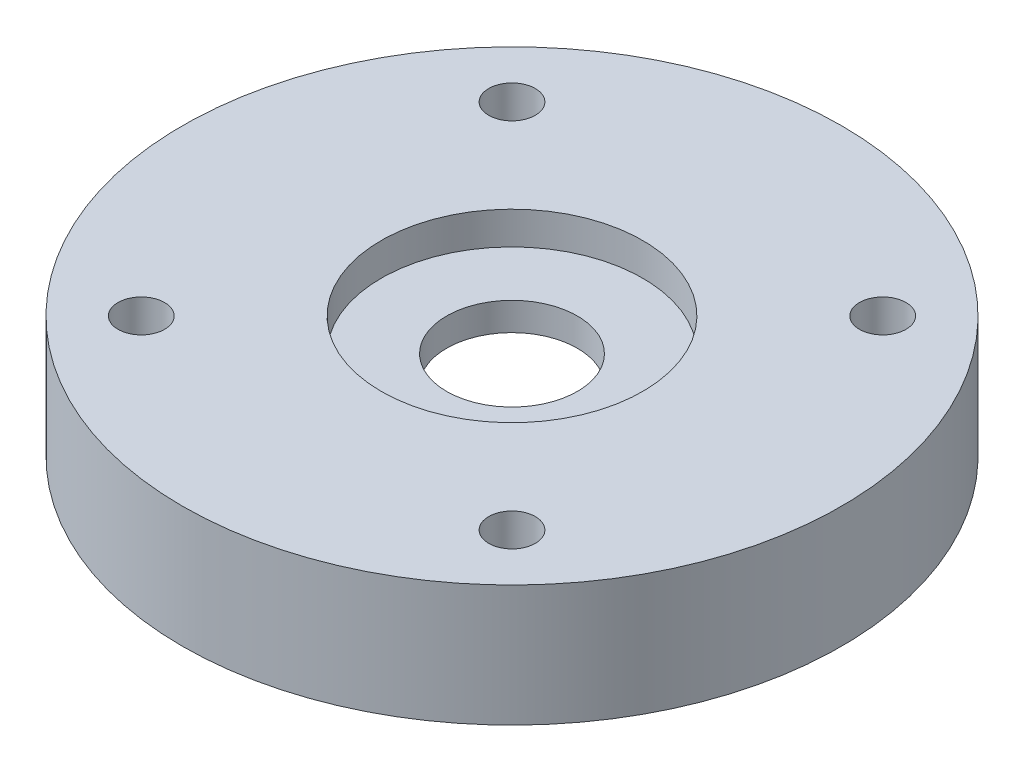
ISO-10303-21;
HEADER;
FILE_DESCRIPTION(('STEP AP214'),'2;1');
FILE_NAME('part.step','',(''),(''),'','','');
FILE_SCHEMA(('AUTOMOTIVE_DESIGN { 1 0 10303 214 1 1 1 1 }'));
ENDSEC;
DATA;
#1=APPLICATION_CONTEXT('core data for automotive mechanical design processes');
#2=APPLICATION_PROTOCOL_DEFINITION('international standard','automotive_design',2000,#1);
#3=PRODUCT_CONTEXT('',#1,'mechanical');
#4=PRODUCT('Part','Part','',(#3));
#5=PRODUCT_RELATED_PRODUCT_CATEGORY('part','',(#4));
#6=PRODUCT_DEFINITION_FORMATION('','',#4);
#7=PRODUCT_DEFINITION_CONTEXT('part definition',#1,'design');
#8=PRODUCT_DEFINITION('design','',#6,#7);
#9=PRODUCT_DEFINITION_SHAPE('','',#8);
#10=(LENGTH_UNIT() NAMED_UNIT(*) SI_UNIT(.MILLI.,.METRE.));
#11=(NAMED_UNIT(*) PLANE_ANGLE_UNIT() SI_UNIT($,.RADIAN.));
#12=(NAMED_UNIT(*) SI_UNIT($,.STERADIAN.) SOLID_ANGLE_UNIT());
#13=UNCERTAINTY_MEASURE_WITH_UNIT(LENGTH_MEASURE(1.E-05),#10,'distance_accuracy_value','');
#14=(GEOMETRIC_REPRESENTATION_CONTEXT(3) GLOBAL_UNCERTAINTY_ASSIGNED_CONTEXT((#13)) GLOBAL_UNIT_ASSIGNED_CONTEXT((#10,
#11,#12)) REPRESENTATION_CONTEXT('',''));
#15=CARTESIAN_POINT('',(0.,0.,0.));
#16=DIRECTION('',(0.,0.,1.));
#17=DIRECTION('',(1.,0.,0.));
#18=AXIS2_PLACEMENT_3D('',#15,#16,#17);
#19=CARTESIAN_POINT('',(0.,5.8928,0.));
#20=DIRECTION('',(0.,-1.,0.));
#21=DIRECTION('',(0.,0.,-1.));
#22=AXIS2_PLACEMENT_3D('',#19,#20,#21);
#23=CYLINDRICAL_SURFACE('',#22,3.175);
#24=CARTESIAN_POINT('',(0.,2.9464,0.));
#25=DIRECTION('',(0.,1.,0.));
#26=DIRECTION('',(0.,0.,1.));
#27=AXIS2_PLACEMENT_3D('',#24,#25,#26);
#28=CIRCLE('',#27,3.175);
#29=CARTESIAN_POINT('',(0.,2.9464,3.175));
#30=VERTEX_POINT('',#29);
#31=EDGE_CURVE('E119',#30,#30,#28,.T.);
#32=ORIENTED_EDGE('',*,*,#31,.F.);
#33=EDGE_LOOP('',(#32));
#34=FACE_BOUND('',#33,.T.);
#35=CARTESIAN_POINT('',(0.,4.3053,0.));
#36=DIRECTION('',(0.,1.,0.));
#37=DIRECTION('',(0.,0.,1.));
#38=AXIS2_PLACEMENT_3D('',#35,#36,#37);
#39=CIRCLE('',#38,3.175);
#40=CARTESIAN_POINT('',(0.,4.3053,3.175));
#41=VERTEX_POINT('',#40);
#42=EDGE_CURVE('E43',#41,#41,#39,.F.);
#43=ORIENTED_EDGE('',*,*,#42,.F.);
#44=EDGE_LOOP('',(#43));
#45=FACE_BOUND('',#44,.T.);
#46=ADVANCED_FACE('F39',(#34,#45),#23,.F.);
#47=CARTESIAN_POINT('',(0.,5.8928,0.));
#48=DIRECTION('',(0.,-1.,0.));
#49=DIRECTION('',(0.,0.,-1.));
#50=AXIS2_PLACEMENT_3D('',#47,#48,#49);
#51=CYLINDRICAL_SURFACE('',#50,16.002);
#52=CARTESIAN_POINT('',(0.,5.8928,0.));
#53=DIRECTION('',(0.,1.,0.));
#54=DIRECTION('',(0.,0.,1.));
#55=AXIS2_PLACEMENT_3D('',#52,#53,#54);
#56=CIRCLE('',#55,16.002);
#57=CARTESIAN_POINT('',(0.,5.8928,16.002));
#58=VERTEX_POINT('',#57);
#59=EDGE_CURVE('E11',#58,#58,#56,.T.);
#60=ORIENTED_EDGE('',*,*,#59,.F.);
#61=EDGE_LOOP('',(#60));
#62=FACE_BOUND('',#61,.T.);
#63=CARTESIAN_POINT('',(0.,0.,0.));
#64=DIRECTION('',(0.,1.,0.));
#65=DIRECTION('',(0.,0.,1.));
#66=AXIS2_PLACEMENT_3D('',#63,#64,#65);
#67=CIRCLE('',#66,16.002);
#68=CARTESIAN_POINT('',(0.,0.,16.002));
#69=VERTEX_POINT('',#68);
#70=EDGE_CURVE('E48',#69,#69,#67,.T.);
#71=ORIENTED_EDGE('',*,*,#70,.T.);
#72=EDGE_LOOP('',(#71));
#73=FACE_BOUND('',#72,.T.);
#74=ADVANCED_FACE('F41',(#62,#73),#51,.T.);
#75=CARTESIAN_POINT('',(0.,5.8928,0.));
#76=DIRECTION('',(0.,1.,0.));
#77=DIRECTION('',(0.,0.,1.));
#78=AXIS2_PLACEMENT_3D('',#75,#76,#77);
#79=PLANE('',#78);
#80=CARTESIAN_POINT('',(0.,5.8928,0.));
#81=DIRECTION('',(0.,1.,0.));
#82=DIRECTION('',(0.,0.,1.));
#83=AXIS2_PLACEMENT_3D('',#80,#81,#82);
#84=CIRCLE('',#83,6.35);
#85=CARTESIAN_POINT('',(0.,5.8928,6.35));
#86=VERTEX_POINT('',#85);
#87=EDGE_CURVE('E132',#86,#86,#84,.T.);
#88=ORIENTED_EDGE('',*,*,#87,.F.);
#89=EDGE_LOOP('',(#88));
#90=FACE_BOUND('',#89,.T.);
#91=CARTESIAN_POINT('',(-8.999982,5.8928,8.999982));
#92=DIRECTION('',(0.,-1.,0.));
#93=DIRECTION('',(0.,0.,-1.));
#94=AXIS2_PLACEMENT_3D('',#91,#92,#93);
#95=CIRCLE('',#94,1.1303);
#96=CARTESIAN_POINT('',(-8.999982,5.8928,7.869682));
#97=VERTEX_POINT('',#96);
#98=EDGE_CURVE('E125',#97,#97,#95,.T.);
#99=ORIENTED_EDGE('',*,*,#98,.T.);
#100=EDGE_LOOP('',(#99));
#101=FACE_BOUND('',#100,.T.);
#102=CARTESIAN_POINT('',(8.999982,5.8928,8.999982));
#103=DIRECTION('',(0.,-1.,0.));
#104=DIRECTION('',(0.,0.,-1.));
#105=AXIS2_PLACEMENT_3D('',#102,#103,#104);
#106=CIRCLE('',#105,1.1303);
#107=CARTESIAN_POINT('',(8.999982,5.8928,7.869682));
#108=VERTEX_POINT('',#107);
#109=EDGE_CURVE('E144',#108,#108,#106,.T.);
#110=ORIENTED_EDGE('',*,*,#109,.T.);
#111=EDGE_LOOP('',(#110));
#112=FACE_BOUND('',#111,.T.);
#113=CARTESIAN_POINT('',(8.999982,5.8928,-8.999982));
#114=DIRECTION('',(0.,-1.,0.));
#115=DIRECTION('',(0.,0.,-1.));
#116=AXIS2_PLACEMENT_3D('',#113,#114,#115);
#117=CIRCLE('',#116,1.1303);
#118=CARTESIAN_POINT('',(8.999982,5.8928,-10.130282));
#119=VERTEX_POINT('',#118);
#120=EDGE_CURVE('E150',#119,#119,#117,.T.);
#121=ORIENTED_EDGE('',*,*,#120,.T.);
#122=EDGE_LOOP('',(#121));
#123=FACE_BOUND('',#122,.T.);
#124=CARTESIAN_POINT('',(-8.999982,5.8928,-8.999982));
#125=DIRECTION('',(0.,-1.,0.));
#126=DIRECTION('',(0.,0.,-1.));
#127=AXIS2_PLACEMENT_3D('',#124,#125,#126);
#128=CIRCLE('',#127,1.1303);
#129=CARTESIAN_POINT('',(-8.999982,5.8928,-10.130282));
#130=VERTEX_POINT('',#129);
#131=EDGE_CURVE('E111',#130,#130,#128,.T.);
#132=ORIENTED_EDGE('',*,*,#131,.T.);
#133=EDGE_LOOP('',(#132));
#134=FACE_BOUND('',#133,.T.);
#135=ORIENTED_EDGE('',*,*,#59,.T.);
#136=EDGE_LOOP('',(#135));
#137=FACE_BOUND('',#136,.T.);
#138=ADVANCED_FACE('F170',(#90,#101,#112,#123,#134,#137),#79,.T.);
#139=CARTESIAN_POINT('',(0.,0.,0.));
#140=DIRECTION('',(0.,1.,0.));
#141=DIRECTION('',(0.,0.,1.));
#142=AXIS2_PLACEMENT_3D('',#139,#140,#141);
#143=PLANE('',#142);
#144=CARTESIAN_POINT('',(-8.999982,0.,8.999982));
#145=DIRECTION('',(0.,-1.,0.));
#146=DIRECTION('',(0.,0.,-1.));
#147=AXIS2_PLACEMENT_3D('',#144,#145,#146);
#148=CIRCLE('',#147,1.13029999999999);
#149=CARTESIAN_POINT('',(-8.999982,0.,7.86968200000001));
#150=VERTEX_POINT('',#149);
#151=EDGE_CURVE('E121',#150,#150,#148,.T.);
#152=ORIENTED_EDGE('',*,*,#151,.F.);
#153=EDGE_LOOP('',(#152));
#154=FACE_BOUND('',#153,.T.);
#155=CARTESIAN_POINT('',(8.999982,0.,8.999982));
#156=DIRECTION('',(0.,-1.,0.));
#157=DIRECTION('',(0.,0.,-1.));
#158=AXIS2_PLACEMENT_3D('',#155,#156,#157);
#159=CIRCLE('',#158,1.13029999999999);
#160=CARTESIAN_POINT('',(8.999982,0.,7.86968200000001));
#161=VERTEX_POINT('',#160);
#162=EDGE_CURVE('E141',#161,#161,#159,.T.);
#163=ORIENTED_EDGE('',*,*,#162,.F.);
#164=EDGE_LOOP('',(#163));
#165=FACE_BOUND('',#164,.T.);
#166=CARTESIAN_POINT('',(8.999982,0.,-8.999982));
#167=DIRECTION('',(0.,-1.,0.));
#168=DIRECTION('',(0.,0.,-1.));
#169=AXIS2_PLACEMENT_3D('',#166,#167,#168);
#170=CIRCLE('',#169,1.13029999999999);
#171=CARTESIAN_POINT('',(8.999982,0.,-10.130282));
#172=VERTEX_POINT('',#171);
#173=EDGE_CURVE('E147',#172,#172,#170,.T.);
#174=ORIENTED_EDGE('',*,*,#173,.F.);
#175=EDGE_LOOP('',(#174));
#176=FACE_BOUND('',#175,.T.);
#177=CARTESIAN_POINT('',(-8.999982,0.,-8.999982));
#178=DIRECTION('',(0.,-1.,0.));
#179=DIRECTION('',(0.,0.,-1.));
#180=AXIS2_PLACEMENT_3D('',#177,#178,#179);
#181=CIRCLE('',#180,1.13029999999999);
#182=CARTESIAN_POINT('',(-8.999982,0.,-10.130282));
#183=VERTEX_POINT('',#182);
#184=EDGE_CURVE('E153',#183,#183,#181,.T.);
#185=ORIENTED_EDGE('',*,*,#184,.F.);
#186=EDGE_LOOP('',(#185));
#187=FACE_BOUND('',#186,.T.);
#188=CARTESIAN_POINT('',(0.,0.,0.));
#189=DIRECTION('',(0.,1.,0.));
#190=DIRECTION('',(0.,0.,1.));
#191=AXIS2_PLACEMENT_3D('',#188,#189,#190);
#192=CIRCLE('',#191,9.9441);
#193=CARTESIAN_POINT('',(-9.017,0.,4.19271222599405));
#194=VERTEX_POINT('',#193);
#195=CARTESIAN_POINT('',(9.017,0.,4.19271222599405));
#196=VERTEX_POINT('',#195);
#197=EDGE_CURVE('E113',#194,#196,#192,.T.);
#198=ORIENTED_EDGE('',*,*,#197,.T.);
#199=DIRECTION('',(0.,0.,1.));
#200=VECTOR('',#199,1.);
#201=CARTESIAN_POINT('',(9.017,0.,0.));
#202=LINE('',#201,#200);
#203=CARTESIAN_POINT('',(9.017,0.,-4.19271222599405));
#204=VERTEX_POINT('',#203);
#205=EDGE_CURVE('E56',#204,#196,#202,.T.);
#206=ORIENTED_EDGE('',*,*,#205,.F.);
#207=CARTESIAN_POINT('',(-9.017,0.,-4.19271222599405));
#208=VERTEX_POINT('',#207);
#209=EDGE_CURVE('E110',#204,#208,#192,.T.);
#210=ORIENTED_EDGE('',*,*,#209,.T.);
#211=DIRECTION('',(0.,0.,1.));
#212=VECTOR('',#211,1.);
#213=CARTESIAN_POINT('',(-9.017,0.,0.));
#214=LINE('',#213,#212);
#215=EDGE_CURVE('E101',#208,#194,#214,.T.);
#216=ORIENTED_EDGE('',*,*,#215,.T.);
#217=EDGE_LOOP('',(#198,#206,#210,#216));
#218=FACE_BOUND('',#217,.T.);
#219=ORIENTED_EDGE('',*,*,#70,.F.);
#220=EDGE_LOOP('',(#219));
#221=FACE_BOUND('',#220,.T.);
#222=ADVANCED_FACE('F159',(#154,#165,#176,#187,#218,#221),#143,.F.);
#223=CARTESIAN_POINT('',(9.017,2.9464,0.));
#224=DIRECTION('',(1.,0.,0.));
#225=DIRECTION('',(0.,0.,-1.));
#226=AXIS2_PLACEMENT_3D('',#223,#224,#225);
#227=PLANE('',#226);
#228=ORIENTED_EDGE('',*,*,#205,.T.);
#229=DIRECTION('',(0.,-1.,0.));
#230=VECTOR('',#229,1.);
#231=CARTESIAN_POINT('',(9.017,2.9464,4.19271222599405));
#232=LINE('',#231,#230);
#233=CARTESIAN_POINT('',(9.017,2.9464,4.19271222599405));
#234=VERTEX_POINT('',#233);
#235=EDGE_CURVE('E106',#234,#196,#232,.T.);
#236=ORIENTED_EDGE('',*,*,#235,.F.);
#237=DIRECTION('',(0.,0.,1.));
#238=VECTOR('',#237,1.);
#239=CARTESIAN_POINT('',(9.017,2.9464,0.));
#240=LINE('',#239,#238);
#241=CARTESIAN_POINT('',(9.017,2.9464,-4.19271222599405));
#242=VERTEX_POINT('',#241);
#243=EDGE_CURVE('E97',#242,#234,#240,.T.);
#244=ORIENTED_EDGE('',*,*,#243,.F.);
#245=DIRECTION('',(0.,-1.,0.));
#246=VECTOR('',#245,1.);
#247=CARTESIAN_POINT('',(9.017,2.9464,-4.19271222599405));
#248=LINE('',#247,#246);
#249=EDGE_CURVE('E86',#242,#204,#248,.T.);
#250=ORIENTED_EDGE('',*,*,#249,.T.);
#251=EDGE_LOOP('',(#228,#236,#244,#250));
#252=FACE_BOUND('',#251,.T.);
#253=ADVANCED_FACE('F162',(#252),#227,.F.);
#254=CARTESIAN_POINT('',(0.,2.9464,0.));
#255=DIRECTION('',(0.,-1.,0.));
#256=DIRECTION('',(0.,0.,-1.));
#257=AXIS2_PLACEMENT_3D('',#254,#255,#256);
#258=CYLINDRICAL_SURFACE('',#257,9.9441);
#259=ORIENTED_EDGE('',*,*,#209,.F.);
#260=ORIENTED_EDGE('',*,*,#249,.F.);
#261=CARTESIAN_POINT('',(0.,2.9464,0.));
#262=DIRECTION('',(0.,1.,0.));
#263=DIRECTION('',(0.,0.,1.));
#264=AXIS2_PLACEMENT_3D('',#261,#262,#263);
#265=CIRCLE('',#264,9.9441);
#266=CARTESIAN_POINT('',(-9.017,2.9464,-4.19271222599405));
#267=VERTEX_POINT('',#266);
#268=EDGE_CURVE('E88',#242,#267,#265,.T.);
#269=ORIENTED_EDGE('',*,*,#268,.T.);
#270=DIRECTION('',(0.,-1.,0.));
#271=VECTOR('',#270,1.);
#272=CARTESIAN_POINT('',(-9.017,2.9464,-4.19271222599405));
#273=LINE('',#272,#271);
#274=EDGE_CURVE('E91',#267,#208,#273,.T.);
#275=ORIENTED_EDGE('',*,*,#274,.T.);
#276=EDGE_LOOP('',(#259,#260,#269,#275));
#277=FACE_BOUND('',#276,.T.);
#278=ADVANCED_FACE('F90',(#277),#258,.F.);
#279=CARTESIAN_POINT('',(-9.017,2.9464,0.));
#280=DIRECTION('',(1.,0.,0.));
#281=DIRECTION('',(0.,0.,-1.));
#282=AXIS2_PLACEMENT_3D('',#279,#280,#281);
#283=PLANE('',#282);
#284=ORIENTED_EDGE('',*,*,#215,.F.);
#285=ORIENTED_EDGE('',*,*,#274,.F.);
#286=DIRECTION('',(0.,0.,1.));
#287=VECTOR('',#286,1.);
#288=CARTESIAN_POINT('',(-9.017,2.9464,0.));
#289=LINE('',#288,#287);
#290=CARTESIAN_POINT('',(-9.017,2.9464,4.19271222599405));
#291=VERTEX_POINT('',#290);
#292=EDGE_CURVE('E96',#267,#291,#289,.T.);
#293=ORIENTED_EDGE('',*,*,#292,.T.);
#294=DIRECTION('',(0.,-1.,0.));
#295=VECTOR('',#294,1.);
#296=CARTESIAN_POINT('',(-9.017,2.9464,4.19271222599405));
#297=LINE('',#296,#295);
#298=EDGE_CURVE('E79',#291,#194,#297,.T.);
#299=ORIENTED_EDGE('',*,*,#298,.T.);
#300=EDGE_LOOP('',(#284,#285,#293,#299));
#301=FACE_BOUND('',#300,.T.);
#302=ADVANCED_FACE('F99',(#301),#283,.T.);
#303=ORIENTED_EDGE('',*,*,#197,.F.);
#304=ORIENTED_EDGE('',*,*,#298,.F.);
#305=EDGE_CURVE('E64',#291,#234,#265,.T.);
#306=ORIENTED_EDGE('',*,*,#305,.T.);
#307=ORIENTED_EDGE('',*,*,#235,.T.);
#308=EDGE_LOOP('',(#303,#304,#306,#307));
#309=FACE_BOUND('',#308,.T.);
#310=ADVANCED_FACE('F161',(#309),#258,.F.);
#311=CARTESIAN_POINT('',(0.,2.9464,0.));
#312=DIRECTION('',(0.,1.,0.));
#313=DIRECTION('',(0.,0.,1.));
#314=AXIS2_PLACEMENT_3D('',#311,#312,#313);
#315=PLANE('',#314);
#316=ORIENTED_EDGE('',*,*,#31,.T.);
#317=EDGE_LOOP('',(#316));
#318=FACE_BOUND('',#317,.T.);
#319=ORIENTED_EDGE('',*,*,#243,.T.);
#320=ORIENTED_EDGE('',*,*,#305,.F.);
#321=ORIENTED_EDGE('',*,*,#292,.F.);
#322=ORIENTED_EDGE('',*,*,#268,.F.);
#323=EDGE_LOOP('',(#319,#320,#321,#322));
#324=FACE_BOUND('',#323,.T.);
#325=ADVANCED_FACE('F104',(#318,#324),#315,.F.);
#326=CARTESIAN_POINT('',(-8.999982,0.,-8.999982));
#327=DIRECTION('',(0.,-1.,0.));
#328=DIRECTION('',(0.,0.,-1.));
#329=AXIS2_PLACEMENT_3D('',#326,#327,#328);
#330=CYLINDRICAL_SURFACE('',#329,1.13029999999999);
#331=ORIENTED_EDGE('',*,*,#131,.F.);
#332=EDGE_LOOP('',(#331));
#333=FACE_BOUND('',#332,.T.);
#334=ORIENTED_EDGE('',*,*,#184,.T.);
#335=EDGE_LOOP('',(#334));
#336=FACE_BOUND('',#335,.T.);
#337=ADVANCED_FACE('F200',(#333,#336),#330,.F.);
#338=CARTESIAN_POINT('',(8.999982,0.,-8.999982));
#339=DIRECTION('',(0.,-1.,0.));
#340=DIRECTION('',(0.,0.,-1.));
#341=AXIS2_PLACEMENT_3D('',#338,#339,#340);
#342=CYLINDRICAL_SURFACE('',#341,1.13029999999999);
#343=ORIENTED_EDGE('',*,*,#120,.F.);
#344=EDGE_LOOP('',(#343));
#345=FACE_BOUND('',#344,.T.);
#346=ORIENTED_EDGE('',*,*,#173,.T.);
#347=EDGE_LOOP('',(#346));
#348=FACE_BOUND('',#347,.T.);
#349=ADVANCED_FACE('F196',(#345,#348),#342,.F.);
#350=CARTESIAN_POINT('',(8.999982,0.,8.999982));
#351=DIRECTION('',(0.,-1.,0.));
#352=DIRECTION('',(0.,0.,-1.));
#353=AXIS2_PLACEMENT_3D('',#350,#351,#352);
#354=CYLINDRICAL_SURFACE('',#353,1.13029999999999);
#355=ORIENTED_EDGE('',*,*,#109,.F.);
#356=EDGE_LOOP('',(#355));
#357=FACE_BOUND('',#356,.T.);
#358=ORIENTED_EDGE('',*,*,#162,.T.);
#359=EDGE_LOOP('',(#358));
#360=FACE_BOUND('',#359,.T.);
#361=ADVANCED_FACE('F192',(#357,#360),#354,.F.);
#362=CARTESIAN_POINT('',(-8.999982,0.,8.999982));
#363=DIRECTION('',(0.,-1.,0.));
#364=DIRECTION('',(0.,0.,-1.));
#365=AXIS2_PLACEMENT_3D('',#362,#363,#364);
#366=CYLINDRICAL_SURFACE('',#365,1.13029999999999);
#367=ORIENTED_EDGE('',*,*,#98,.F.);
#368=EDGE_LOOP('',(#367));
#369=FACE_BOUND('',#368,.T.);
#370=ORIENTED_EDGE('',*,*,#151,.T.);
#371=EDGE_LOOP('',(#370));
#372=FACE_BOUND('',#371,.T.);
#373=ADVANCED_FACE('F188',(#369,#372),#366,.F.);
#374=CARTESIAN_POINT('',(0.,4.3053,0.));
#375=DIRECTION('',(0.,1.,0.));
#376=DIRECTION('',(0.,0.,1.));
#377=AXIS2_PLACEMENT_3D('',#374,#375,#376);
#378=PLANE('',#377);
#379=CARTESIAN_POINT('',(0.,4.3053,0.));
#380=DIRECTION('',(0.,1.,0.));
#381=DIRECTION('',(0.,0.,1.));
#382=AXIS2_PLACEMENT_3D('',#379,#380,#381);
#383=CIRCLE('',#382,6.35);
#384=CARTESIAN_POINT('',(0.,4.3053,6.35));
#385=VERTEX_POINT('',#384);
#386=EDGE_CURVE('E128',#385,#385,#383,.T.);
#387=ORIENTED_EDGE('',*,*,#386,.T.);
#388=EDGE_LOOP('',(#387));
#389=FACE_BOUND('',#388,.T.);
#390=ORIENTED_EDGE('',*,*,#42,.T.);
#391=EDGE_LOOP('',(#390));
#392=FACE_BOUND('',#391,.T.);
#393=ADVANCED_FACE('F191',(#389,#392),#378,.T.);
#394=CARTESIAN_POINT('',(0.,4.3053,0.));
#395=DIRECTION('',(0.,1.,0.));
#396=DIRECTION('',(0.,0.,1.));
#397=AXIS2_PLACEMENT_3D('',#394,#395,#396);
#398=CYLINDRICAL_SURFACE('',#397,6.35);
#399=ORIENTED_EDGE('',*,*,#386,.F.);
#400=EDGE_LOOP('',(#399));
#401=FACE_BOUND('',#400,.T.);
#402=ORIENTED_EDGE('',*,*,#87,.T.);
#403=EDGE_LOOP('',(#402));
#404=FACE_BOUND('',#403,.T.);
#405=ADVANCED_FACE('F186',(#401,#404),#398,.F.);
#406=CLOSED_SHELL('',(#46,#74,#138,#222,#253,#278,#302,#310,#325,#337,#349,#361,#373,#393,#405));
#407=MANIFOLD_SOLID_BREP('B2',#406);
#408=ADVANCED_BREP_SHAPE_REPRESENTATION('',(#18,#407),#14);
#409=SHAPE_DEFINITION_REPRESENTATION(#9,#408);
ENDSEC;
END-ISO-10303-21;
